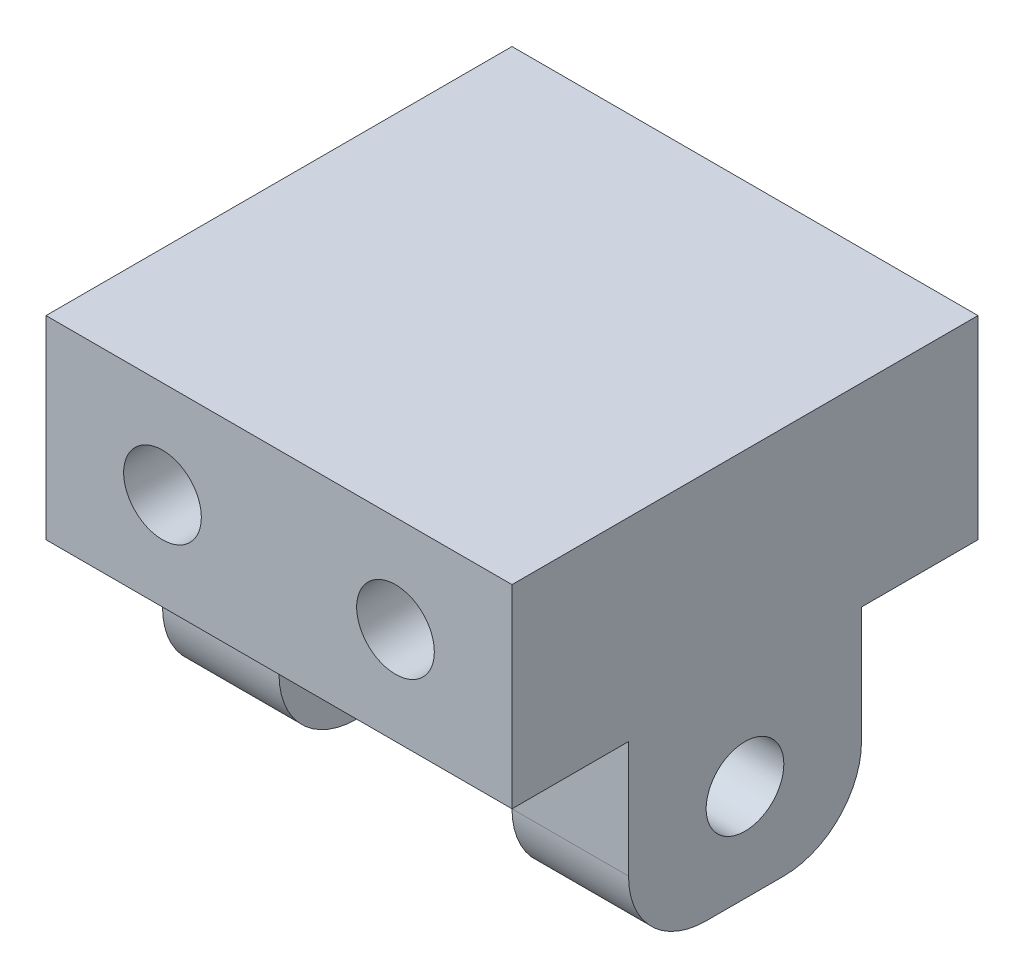
ISO-10303-21;
HEADER;
FILE_DESCRIPTION(('STEP AP214'),'2;1');
FILE_NAME('part.step','',(''),(''),'','','');
FILE_SCHEMA(('AUTOMOTIVE_DESIGN { 1 0 10303 214 1 1 1 1 }'));
ENDSEC;
DATA;
#1=APPLICATION_CONTEXT('core data for automotive mechanical design processes');
#2=APPLICATION_PROTOCOL_DEFINITION('international standard','automotive_design',2000,#1);
#3=PRODUCT_CONTEXT('',#1,'mechanical');
#4=PRODUCT('Part','Part','',(#3));
#5=PRODUCT_RELATED_PRODUCT_CATEGORY('part','',(#4));
#6=PRODUCT_DEFINITION_FORMATION('','',#4);
#7=PRODUCT_DEFINITION_CONTEXT('part definition',#1,'design');
#8=PRODUCT_DEFINITION('design','',#6,#7);
#9=PRODUCT_DEFINITION_SHAPE('','',#8);
#10=(LENGTH_UNIT() NAMED_UNIT(*) SI_UNIT(.MILLI.,.METRE.));
#11=(NAMED_UNIT(*) PLANE_ANGLE_UNIT() SI_UNIT($,.RADIAN.));
#12=(NAMED_UNIT(*) SI_UNIT($,.STERADIAN.) SOLID_ANGLE_UNIT());
#13=UNCERTAINTY_MEASURE_WITH_UNIT(LENGTH_MEASURE(1.E-05),#10,'distance_accuracy_value','');
#14=(GEOMETRIC_REPRESENTATION_CONTEXT(3) GLOBAL_UNCERTAINTY_ASSIGNED_CONTEXT((#13)) GLOBAL_UNIT_ASSIGNED_CONTEXT((#10,
#11,#12)) REPRESENTATION_CONTEXT('',''));
#15=CARTESIAN_POINT('',(0.,0.,0.));
#16=DIRECTION('',(0.,0.,1.));
#17=DIRECTION('',(1.,0.,0.));
#18=AXIS2_PLACEMENT_3D('',#15,#16,#17);
#19=CARTESIAN_POINT('',(-6.,-2.5,-6.));
#20=DIRECTION('',(0.,-1.,0.));
#21=DIRECTION('',(1.,0.,0.));
#22=AXIS2_PLACEMENT_3D('',#19,#20,#21);
#23=PLANE('',#22);
#24=DIRECTION('',(0.,0.,1.));
#25=VECTOR('',#24,1.);
#26=CARTESIAN_POINT('',(-6.,-2.5,-6.));
#27=LINE('',#26,#25);
#28=CARTESIAN_POINT('',(-6.,-2.5,3.));
#29=VERTEX_POINT('',#28);
#30=CARTESIAN_POINT('',(-6.,-2.5,6.));
#31=VERTEX_POINT('',#30);
#32=EDGE_CURVE('E180',#29,#31,#27,.T.);
#33=ORIENTED_EDGE('',*,*,#32,.F.);
#34=DIRECTION('',(-1.,0.,0.));
#35=VECTOR('',#34,1.);
#36=CARTESIAN_POINT('',(-3.,-2.5,3.));
#37=LINE('',#36,#35);
#38=CARTESIAN_POINT('',(-3.,-2.5,3.));
#39=VERTEX_POINT('',#38);
#40=EDGE_CURVE('E173',#39,#29,#37,.T.);
#41=ORIENTED_EDGE('',*,*,#40,.F.);
#42=DIRECTION('',(0.,0.,1.));
#43=VECTOR('',#42,1.);
#44=CARTESIAN_POINT('',(-3.,-2.5,3.));
#45=LINE('',#44,#43);
#46=CARTESIAN_POINT('',(-3.,-2.5,-3.));
#47=VERTEX_POINT('',#46);
#48=EDGE_CURVE('E160',#47,#39,#45,.T.);
#49=ORIENTED_EDGE('',*,*,#48,.F.);
#50=DIRECTION('',(-1.,0.,0.));
#51=VECTOR('',#50,1.);
#52=CARTESIAN_POINT('',(-3.,-2.5,-3.));
#53=LINE('',#52,#51);
#54=CARTESIAN_POINT('',(-6.,-2.5,-3.));
#55=VERTEX_POINT('',#54);
#56=EDGE_CURVE('E182',#47,#55,#53,.T.);
#57=ORIENTED_EDGE('',*,*,#56,.T.);
#58=CARTESIAN_POINT('',(-6.,-2.5,-6.));
#59=VERTEX_POINT('',#58);
#60=EDGE_CURVE('E293',#59,#55,#27,.T.);
#61=ORIENTED_EDGE('',*,*,#60,.F.);
#62=DIRECTION('',(1.,0.,0.));
#63=VECTOR('',#62,1.);
#64=CARTESIAN_POINT('',(-6.,-2.5,-6.));
#65=LINE('',#64,#63);
#66=CARTESIAN_POINT('',(6.,-2.5,-6.));
#67=VERTEX_POINT('',#66);
#68=EDGE_CURVE('E269',#59,#67,#65,.T.);
#69=ORIENTED_EDGE('',*,*,#68,.T.);
#70=DIRECTION('',(0.,0.,1.));
#71=VECTOR('',#70,1.);
#72=CARTESIAN_POINT('',(6.,-2.5,-6.));
#73=LINE('',#72,#71);
#74=CARTESIAN_POINT('',(6.,-2.5,-3.));
#75=VERTEX_POINT('',#74);
#76=EDGE_CURVE('E288',#67,#75,#73,.T.);
#77=ORIENTED_EDGE('',*,*,#76,.T.);
#78=DIRECTION('',(1.,0.,0.));
#79=VECTOR('',#78,1.);
#80=CARTESIAN_POINT('',(3.,-2.5,-3.));
#81=LINE('',#80,#79);
#82=CARTESIAN_POINT('',(3.,-2.5,-3.));
#83=VERTEX_POINT('',#82);
#84=EDGE_CURVE('E216',#83,#75,#81,.T.);
#85=ORIENTED_EDGE('',*,*,#84,.F.);
#86=DIRECTION('',(0.,0.,1.));
#87=VECTOR('',#86,1.);
#88=CARTESIAN_POINT('',(3.,-2.5,3.));
#89=LINE('',#88,#87);
#90=CARTESIAN_POINT('',(3.,-2.5,3.));
#91=VERTEX_POINT('',#90);
#92=EDGE_CURVE('E212',#83,#91,#89,.T.);
#93=ORIENTED_EDGE('',*,*,#92,.T.);
#94=DIRECTION('',(1.,0.,0.));
#95=VECTOR('',#94,1.);
#96=CARTESIAN_POINT('',(3.,-2.5,3.));
#97=LINE('',#96,#95);
#98=CARTESIAN_POINT('',(6.,-2.5,3.));
#99=VERTEX_POINT('',#98);
#100=EDGE_CURVE('E226',#91,#99,#97,.T.);
#101=ORIENTED_EDGE('',*,*,#100,.T.);
#102=CARTESIAN_POINT('',(6.,-2.5,6.));
#103=VERTEX_POINT('',#102);
#104=EDGE_CURVE('E292',#99,#103,#73,.T.);
#105=ORIENTED_EDGE('',*,*,#104,.T.);
#106=DIRECTION('',(1.,0.,0.));
#107=VECTOR('',#106,1.);
#108=CARTESIAN_POINT('',(-6.,-2.5,6.));
#109=LINE('',#108,#107);
#110=EDGE_CURVE('E253',#31,#103,#109,.T.);
#111=ORIENTED_EDGE('',*,*,#110,.F.);
#112=EDGE_LOOP('',(#33,#41,#49,#57,#61,#69,#77,#85,#93,#101,#105,#111));
#113=FACE_BOUND('',#112,.T.);
#114=ADVANCED_FACE('F45',(#113),#23,.T.);
#115=CARTESIAN_POINT('',(-6.,2.5,-6.));
#116=DIRECTION('',(-1.,0.,0.));
#117=DIRECTION('',(0.,0.,1.));
#118=AXIS2_PLACEMENT_3D('',#115,#116,#117);
#119=PLANE('',#118);
#120=DIRECTION('',(0.,0.,-1.));
#121=VECTOR('',#120,1.);
#122=CARTESIAN_POINT('',(-6.,-7.5,3.));
#123=LINE('',#122,#121);
#124=CARTESIAN_POINT('',(-6.,-7.5,0.999999999999999));
#125=VERTEX_POINT('',#124);
#126=CARTESIAN_POINT('',(-6.,-7.5,-1.));
#127=VERTEX_POINT('',#126);
#128=EDGE_CURVE('E176',#125,#127,#123,.T.);
#129=ORIENTED_EDGE('',*,*,#128,.F.);
#130=CARTESIAN_POINT('',(-6.,-5.5,0.999999999999999));
#131=DIRECTION('',(-1.,0.,0.));
#132=DIRECTION('',(0.,0.,1.));
#133=AXIS2_PLACEMENT_3D('',#130,#131,#132);
#134=CIRCLE('',#133,2.);
#135=CARTESIAN_POINT('',(-6.,-5.5,3.));
#136=VERTEX_POINT('',#135);
#137=EDGE_CURVE('E332',#125,#136,#134,.T.);
#138=ORIENTED_EDGE('',*,*,#137,.T.);
#139=DIRECTION('',(0.,-1.,0.));
#140=VECTOR('',#139,1.);
#141=CARTESIAN_POINT('',(-6.,-2.5,3.));
#142=LINE('',#141,#140);
#143=EDGE_CURVE('E351',#29,#136,#142,.T.);
#144=ORIENTED_EDGE('',*,*,#143,.F.);
#145=ORIENTED_EDGE('',*,*,#32,.T.);
#146=DIRECTION('',(0.,-1.,0.));
#147=VECTOR('',#146,1.);
#148=CARTESIAN_POINT('',(-6.,2.5,6.));
#149=LINE('',#148,#147);
#150=CARTESIAN_POINT('',(-6.,2.5,6.));
#151=VERTEX_POINT('',#150);
#152=EDGE_CURVE('E243',#151,#31,#149,.T.);
#153=ORIENTED_EDGE('',*,*,#152,.F.);
#154=DIRECTION('',(0.,0.,1.));
#155=VECTOR('',#154,1.);
#156=CARTESIAN_POINT('',(-6.,2.5,-6.));
#157=LINE('',#156,#155);
#158=CARTESIAN_POINT('',(-6.,2.5,-6.));
#159=VERTEX_POINT('',#158);
#160=EDGE_CURVE('E281',#159,#151,#157,.T.);
#161=ORIENTED_EDGE('',*,*,#160,.F.);
#162=DIRECTION('',(0.,-1.,0.));
#163=VECTOR('',#162,1.);
#164=CARTESIAN_POINT('',(-6.,2.5,-6.));
#165=LINE('',#164,#163);
#166=EDGE_CURVE('E265',#159,#59,#165,.T.);
#167=ORIENTED_EDGE('',*,*,#166,.T.);
#168=ORIENTED_EDGE('',*,*,#60,.T.);
#169=DIRECTION('',(0.,1.,0.));
#170=VECTOR('',#169,1.);
#171=CARTESIAN_POINT('',(-6.,-2.5,-3.));
#172=LINE('',#171,#170);
#173=CARTESIAN_POINT('',(-6.,-5.5,-3.));
#174=VERTEX_POINT('',#173);
#175=EDGE_CURVE('E353',#174,#55,#172,.T.);
#176=ORIENTED_EDGE('',*,*,#175,.F.);
#177=CARTESIAN_POINT('',(-6.,-5.5,-1.));
#178=DIRECTION('',(-1.,0.,0.));
#179=DIRECTION('',(0.,0.,1.));
#180=AXIS2_PLACEMENT_3D('',#177,#178,#179);
#181=CIRCLE('',#180,2.);
#182=EDGE_CURVE('E329',#174,#127,#181,.T.);
#183=ORIENTED_EDGE('',*,*,#182,.T.);
#184=EDGE_LOOP('',(#129,#138,#144,#145,#153,#161,#167,#168,#176,#183));
#185=FACE_BOUND('',#184,.T.);
#186=CARTESIAN_POINT('',(-6.,-5.,0.));
#187=DIRECTION('',(1.,0.,0.));
#188=DIRECTION('',(0.,0.,-1.));
#189=AXIS2_PLACEMENT_3D('',#186,#187,#188);
#190=CIRCLE('',#189,1.);
#191=CARTESIAN_POINT('',(-6.,-5.,-1.));
#192=VERTEX_POINT('',#191);
#193=EDGE_CURVE('E360',#192,#192,#190,.T.);
#194=ORIENTED_EDGE('',*,*,#193,.T.);
#195=EDGE_LOOP('',(#194));
#196=FACE_BOUND('',#195,.T.);
#197=ADVANCED_FACE('F349',(#185,#196),#119,.T.);
#198=CARTESIAN_POINT('',(-6.,2.5,-6.));
#199=DIRECTION('',(0.,1.,0.));
#200=DIRECTION('',(-1.,0.,0.));
#201=AXIS2_PLACEMENT_3D('',#198,#199,#200);
#202=PLANE('',#201);
#203=ORIENTED_EDGE('',*,*,#160,.T.);
#204=DIRECTION('',(-1.,0.,0.));
#205=VECTOR('',#204,1.);
#206=CARTESIAN_POINT('',(-6.,2.5,6.));
#207=LINE('',#206,#205);
#208=CARTESIAN_POINT('',(6.,2.5,6.));
#209=VERTEX_POINT('',#208);
#210=EDGE_CURVE('E261',#209,#151,#207,.T.);
#211=ORIENTED_EDGE('',*,*,#210,.F.);
#212=DIRECTION('',(0.,0.,1.));
#213=VECTOR('',#212,1.);
#214=CARTESIAN_POINT('',(6.,2.5,-6.));
#215=LINE('',#214,#213);
#216=CARTESIAN_POINT('',(6.,2.5,-6.));
#217=VERTEX_POINT('',#216);
#218=EDGE_CURVE('E285',#217,#209,#215,.T.);
#219=ORIENTED_EDGE('',*,*,#218,.F.);
#220=DIRECTION('',(-1.,0.,0.));
#221=VECTOR('',#220,1.);
#222=CARTESIAN_POINT('',(-6.,2.5,-6.));
#223=LINE('',#222,#221);
#224=EDGE_CURVE('E277',#217,#159,#223,.T.);
#225=ORIENTED_EDGE('',*,*,#224,.T.);
#226=EDGE_LOOP('',(#203,#211,#219,#225));
#227=FACE_BOUND('',#226,.T.);
#228=ADVANCED_FACE('F419',(#227),#202,.T.);
#229=CARTESIAN_POINT('',(6.,2.5,-6.));
#230=DIRECTION('',(1.,0.,0.));
#231=DIRECTION('',(0.,0.,-1.));
#232=AXIS2_PLACEMENT_3D('',#229,#230,#231);
#233=PLANE('',#232);
#234=DIRECTION('',(0.,-1.,0.));
#235=VECTOR('',#234,1.);
#236=CARTESIAN_POINT('',(6.,-2.5,3.));
#237=LINE('',#236,#235);
#238=CARTESIAN_POINT('',(6.,-5.5,3.));
#239=VERTEX_POINT('',#238);
#240=EDGE_CURVE('E196',#99,#239,#237,.T.);
#241=ORIENTED_EDGE('',*,*,#240,.T.);
#242=CARTESIAN_POINT('',(6.,-5.5,0.999999999999999));
#243=DIRECTION('',(1.,0.,0.));
#244=DIRECTION('',(0.,0.,-1.));
#245=AXIS2_PLACEMENT_3D('',#242,#243,#244);
#246=CIRCLE('',#245,2.);
#247=CARTESIAN_POINT('',(6.,-7.5,0.999999999999999));
#248=VERTEX_POINT('',#247);
#249=EDGE_CURVE('E303',#239,#248,#246,.T.);
#250=ORIENTED_EDGE('',*,*,#249,.T.);
#251=DIRECTION('',(0.,0.,-1.));
#252=VECTOR('',#251,1.);
#253=CARTESIAN_POINT('',(6.,-7.5,3.));
#254=LINE('',#253,#252);
#255=CARTESIAN_POINT('',(6.,-7.5,-1.));
#256=VERTEX_POINT('',#255);
#257=EDGE_CURVE('E220',#248,#256,#254,.T.);
#258=ORIENTED_EDGE('',*,*,#257,.T.);
#259=CARTESIAN_POINT('',(6.,-5.5,-1.));
#260=DIRECTION('',(1.,0.,0.));
#261=DIRECTION('',(0.,0.,-1.));
#262=AXIS2_PLACEMENT_3D('',#259,#260,#261);
#263=CIRCLE('',#262,2.);
#264=CARTESIAN_POINT('',(6.,-5.5,-3.));
#265=VERTEX_POINT('',#264);
#266=EDGE_CURVE('E300',#256,#265,#263,.T.);
#267=ORIENTED_EDGE('',*,*,#266,.T.);
#268=DIRECTION('',(0.,1.,0.));
#269=VECTOR('',#268,1.);
#270=CARTESIAN_POINT('',(6.,-2.5,-3.));
#271=LINE('',#270,#269);
#272=EDGE_CURVE('E205',#265,#75,#271,.T.);
#273=ORIENTED_EDGE('',*,*,#272,.T.);
#274=ORIENTED_EDGE('',*,*,#76,.F.);
#275=DIRECTION('',(0.,1.,0.));
#276=VECTOR('',#275,1.);
#277=CARTESIAN_POINT('',(6.,2.5,-6.));
#278=LINE('',#277,#276);
#279=EDGE_CURVE('E273',#67,#217,#278,.T.);
#280=ORIENTED_EDGE('',*,*,#279,.T.);
#281=ORIENTED_EDGE('',*,*,#218,.T.);
#282=DIRECTION('',(0.,1.,0.));
#283=VECTOR('',#282,1.);
#284=CARTESIAN_POINT('',(6.,2.5,6.));
#285=LINE('',#284,#283);
#286=EDGE_CURVE('E257',#103,#209,#285,.T.);
#287=ORIENTED_EDGE('',*,*,#286,.F.);
#288=ORIENTED_EDGE('',*,*,#104,.F.);
#289=EDGE_LOOP('',(#241,#250,#258,#267,#273,#274,#280,#281,#287,#288));
#290=FACE_BOUND('',#289,.T.);
#291=CARTESIAN_POINT('',(6.,-5.,0.));
#292=DIRECTION('',(1.,0.,0.));
#293=DIRECTION('',(0.,0.,-1.));
#294=AXIS2_PLACEMENT_3D('',#291,#292,#293);
#295=CIRCLE('',#294,1.);
#296=CARTESIAN_POINT('',(6.,-5.,-1.));
#297=VERTEX_POINT('',#296);
#298=EDGE_CURVE('E187',#297,#297,#295,.T.);
#299=ORIENTED_EDGE('',*,*,#298,.F.);
#300=EDGE_LOOP('',(#299));
#301=FACE_BOUND('',#300,.T.);
#302=ADVANCED_FACE('F376',(#290,#301),#233,.T.);
#303=CARTESIAN_POINT('',(0.,0.,-6.));
#304=DIRECTION('',(0.,0.,1.));
#305=DIRECTION('',(1.,0.,0.));
#306=AXIS2_PLACEMENT_3D('',#303,#304,#305);
#307=PLANE('',#306);
#308=CARTESIAN_POINT('',(-3.,0.,-6.));
#309=DIRECTION('',(0.,0.,1.));
#310=DIRECTION('',(1.,0.,0.));
#311=AXIS2_PLACEMENT_3D('',#308,#309,#310);
#312=CIRCLE('',#311,1.);
#313=CARTESIAN_POINT('',(-2.,0.,-6.));
#314=VERTEX_POINT('',#313);
#315=EDGE_CURVE('E238',#314,#314,#312,.F.);
#316=ORIENTED_EDGE('',*,*,#315,.F.);
#317=EDGE_LOOP('',(#316));
#318=FACE_BOUND('',#317,.T.);
#319=CARTESIAN_POINT('',(3.,0.,-6.));
#320=DIRECTION('',(0.,0.,1.));
#321=DIRECTION('',(1.,0.,0.));
#322=AXIS2_PLACEMENT_3D('',#319,#320,#321);
#323=CIRCLE('',#322,1.);
#324=CARTESIAN_POINT('',(4.,0.,-6.));
#325=VERTEX_POINT('',#324);
#326=EDGE_CURVE('E230',#325,#325,#323,.F.);
#327=ORIENTED_EDGE('',*,*,#326,.F.);
#328=EDGE_LOOP('',(#327));
#329=FACE_BOUND('',#328,.T.);
#330=ORIENTED_EDGE('',*,*,#166,.F.);
#331=ORIENTED_EDGE('',*,*,#224,.F.);
#332=ORIENTED_EDGE('',*,*,#279,.F.);
#333=ORIENTED_EDGE('',*,*,#68,.F.);
#334=EDGE_LOOP('',(#330,#331,#332,#333));
#335=FACE_BOUND('',#334,.T.);
#336=ADVANCED_FACE('F373',(#318,#329,#335),#307,.F.);
#337=CARTESIAN_POINT('',(0.,0.,6.));
#338=DIRECTION('',(0.,0.,1.));
#339=DIRECTION('',(1.,0.,0.));
#340=AXIS2_PLACEMENT_3D('',#337,#338,#339);
#341=PLANE('',#340);
#342=CARTESIAN_POINT('',(-3.,0.,6.));
#343=DIRECTION('',(0.,0.,1.));
#344=DIRECTION('',(1.,0.,0.));
#345=AXIS2_PLACEMENT_3D('',#342,#343,#344);
#346=CIRCLE('',#345,1.);
#347=CARTESIAN_POINT('',(-2.,0.,6.));
#348=VERTEX_POINT('',#347);
#349=EDGE_CURVE('E234',#348,#348,#346,.T.);
#350=ORIENTED_EDGE('',*,*,#349,.F.);
#351=EDGE_LOOP('',(#350));
#352=FACE_BOUND('',#351,.T.);
#353=CARTESIAN_POINT('',(3.,0.,6.));
#354=DIRECTION('',(0.,0.,1.));
#355=DIRECTION('',(1.,0.,0.));
#356=AXIS2_PLACEMENT_3D('',#353,#354,#355);
#357=CIRCLE('',#356,1.);
#358=CARTESIAN_POINT('',(4.,0.,6.));
#359=VERTEX_POINT('',#358);
#360=EDGE_CURVE('E239',#359,#359,#357,.T.);
#361=ORIENTED_EDGE('',*,*,#360,.F.);
#362=EDGE_LOOP('',(#361));
#363=FACE_BOUND('',#362,.T.);
#364=ORIENTED_EDGE('',*,*,#152,.T.);
#365=ORIENTED_EDGE('',*,*,#110,.T.);
#366=ORIENTED_EDGE('',*,*,#286,.T.);
#367=ORIENTED_EDGE('',*,*,#210,.T.);
#368=EDGE_LOOP('',(#364,#365,#366,#367));
#369=FACE_BOUND('',#368,.T.);
#370=ADVANCED_FACE('F429',(#352,#363,#369),#341,.T.);
#371=CARTESIAN_POINT('',(3.,0.,-8.82842712474619));
#372=DIRECTION('',(0.,0.,1.));
#373=DIRECTION('',(1.,0.,0.));
#374=AXIS2_PLACEMENT_3D('',#371,#372,#373);
#375=CYLINDRICAL_SURFACE('',#374,1.);
#376=ORIENTED_EDGE('',*,*,#326,.T.);
#377=EDGE_LOOP('',(#376));
#378=FACE_BOUND('',#377,.T.);
#379=ORIENTED_EDGE('',*,*,#360,.T.);
#380=EDGE_LOOP('',(#379));
#381=FACE_BOUND('',#380,.T.);
#382=ADVANCED_FACE('F433',(#378,#381),#375,.F.);
#383=CARTESIAN_POINT('',(-3.,0.,-8.82842712474619));
#384=DIRECTION('',(0.,0.,1.));
#385=DIRECTION('',(1.,0.,0.));
#386=AXIS2_PLACEMENT_3D('',#383,#384,#385);
#387=CYLINDRICAL_SURFACE('',#386,1.);
#388=ORIENTED_EDGE('',*,*,#315,.T.);
#389=EDGE_LOOP('',(#388));
#390=FACE_BOUND('',#389,.T.);
#391=ORIENTED_EDGE('',*,*,#349,.T.);
#392=EDGE_LOOP('',(#391));
#393=FACE_BOUND('',#392,.T.);
#394=ADVANCED_FACE('F437',(#390,#393),#387,.F.);
#395=CARTESIAN_POINT('',(3.,-2.5,3.));
#396=DIRECTION('',(0.,0.,1.));
#397=DIRECTION('',(1.,0.,0.));
#398=AXIS2_PLACEMENT_3D('',#395,#396,#397);
#399=PLANE('',#398);
#400=DIRECTION('',(0.,-1.,0.));
#401=VECTOR('',#400,1.);
#402=CARTESIAN_POINT('',(3.,-2.5,3.));
#403=LINE('',#402,#401);
#404=CARTESIAN_POINT('',(3.,-5.5,3.));
#405=VERTEX_POINT('',#404);
#406=EDGE_CURVE('E200',#91,#405,#403,.T.);
#407=ORIENTED_EDGE('',*,*,#406,.T.);
#408=DIRECTION('',(1.,0.,0.));
#409=VECTOR('',#408,1.);
#410=CARTESIAN_POINT('',(3.,-5.5,3.));
#411=LINE('',#410,#409);
#412=EDGE_CURVE('E284',#405,#239,#411,.T.);
#413=ORIENTED_EDGE('',*,*,#412,.T.);
#414=ORIENTED_EDGE('',*,*,#240,.F.);
#415=ORIENTED_EDGE('',*,*,#100,.F.);
#416=EDGE_LOOP('',(#407,#413,#414,#415));
#417=FACE_BOUND('',#416,.T.);
#418=ADVANCED_FACE('F394',(#417),#399,.T.);
#419=CARTESIAN_POINT('',(3.,-2.5,-3.));
#420=DIRECTION('',(0.,0.,-1.));
#421=DIRECTION('',(-1.,0.,0.));
#422=AXIS2_PLACEMENT_3D('',#419,#420,#421);
#423=PLANE('',#422);
#424=ORIENTED_EDGE('',*,*,#272,.F.);
#425=DIRECTION('',(1.,0.,0.));
#426=VECTOR('',#425,1.);
#427=CARTESIAN_POINT('',(3.,-5.5,-3.));
#428=LINE('',#427,#426);
#429=CARTESIAN_POINT('',(3.,-5.5,-3.));
#430=VERTEX_POINT('',#429);
#431=EDGE_CURVE('E319',#265,#430,#428,.F.);
#432=ORIENTED_EDGE('',*,*,#431,.T.);
#433=DIRECTION('',(0.,1.,0.));
#434=VECTOR('',#433,1.);
#435=CARTESIAN_POINT('',(3.,-2.5,-3.));
#436=LINE('',#435,#434);
#437=EDGE_CURVE('E209',#430,#83,#436,.T.);
#438=ORIENTED_EDGE('',*,*,#437,.T.);
#439=ORIENTED_EDGE('',*,*,#84,.T.);
#440=EDGE_LOOP('',(#424,#432,#438,#439));
#441=FACE_BOUND('',#440,.T.);
#442=ADVANCED_FACE('F383',(#441),#423,.T.);
#443=CARTESIAN_POINT('',(3.,-7.5,3.));
#444=DIRECTION('',(0.,-1.,0.));
#445=DIRECTION('',(0.,0.,-1.));
#446=AXIS2_PLACEMENT_3D('',#443,#444,#445);
#447=PLANE('',#446);
#448=ORIENTED_EDGE('',*,*,#257,.F.);
#449=DIRECTION('',(1.,0.,0.));
#450=VECTOR('',#449,1.);
#451=CARTESIAN_POINT('',(3.,-7.5,0.999999999999999));
#452=LINE('',#451,#450);
#453=CARTESIAN_POINT('',(3.,-7.5,0.999999999999999));
#454=VERTEX_POINT('',#453);
#455=EDGE_CURVE('E310',#248,#454,#452,.F.);
#456=ORIENTED_EDGE('',*,*,#455,.T.);
#457=DIRECTION('',(0.,0.,-1.));
#458=VECTOR('',#457,1.);
#459=CARTESIAN_POINT('',(3.,-7.5,3.));
#460=LINE('',#459,#458);
#461=CARTESIAN_POINT('',(3.,-7.5,-1.));
#462=VERTEX_POINT('',#461);
#463=EDGE_CURVE('E204',#454,#462,#460,.T.);
#464=ORIENTED_EDGE('',*,*,#463,.T.);
#465=DIRECTION('',(1.,0.,0.));
#466=VECTOR('',#465,1.);
#467=CARTESIAN_POINT('',(3.,-7.5,-1.));
#468=LINE('',#467,#466);
#469=EDGE_CURVE('E306',#462,#256,#468,.T.);
#470=ORIENTED_EDGE('',*,*,#469,.T.);
#471=EDGE_LOOP('',(#448,#456,#464,#470));
#472=FACE_BOUND('',#471,.T.);
#473=ADVANCED_FACE('F401',(#472),#447,.T.);
#474=CARTESIAN_POINT('',(3.,0.,0.));
#475=DIRECTION('',(1.,0.,0.));
#476=DIRECTION('',(0.,0.,-1.));
#477=AXIS2_PLACEMENT_3D('',#474,#475,#476);
#478=PLANE('',#477);
#479=CARTESIAN_POINT('',(3.,-5.,0.));
#480=DIRECTION('',(1.,0.,0.));
#481=DIRECTION('',(0.,0.,-1.));
#482=AXIS2_PLACEMENT_3D('',#479,#480,#481);
#483=CIRCLE('',#482,1.);
#484=CARTESIAN_POINT('',(3.,-5.,-1.));
#485=VERTEX_POINT('',#484);
#486=EDGE_CURVE('E192',#485,#485,#483,.T.);
#487=ORIENTED_EDGE('',*,*,#486,.T.);
#488=EDGE_LOOP('',(#487));
#489=FACE_BOUND('',#488,.T.);
#490=ORIENTED_EDGE('',*,*,#463,.F.);
#491=CARTESIAN_POINT('',(3.,-5.5,0.999999999999999));
#492=DIRECTION('',(1.,0.,0.));
#493=DIRECTION('',(0.,0.,-1.));
#494=AXIS2_PLACEMENT_3D('',#491,#492,#493);
#495=CIRCLE('',#494,2.);
#496=EDGE_CURVE('E316',#454,#405,#495,.F.);
#497=ORIENTED_EDGE('',*,*,#496,.T.);
#498=ORIENTED_EDGE('',*,*,#406,.F.);
#499=ORIENTED_EDGE('',*,*,#92,.F.);
#500=ORIENTED_EDGE('',*,*,#437,.F.);
#501=CARTESIAN_POINT('',(3.,-5.5,-1.));
#502=DIRECTION('',(1.,0.,0.));
#503=DIRECTION('',(0.,0.,-1.));
#504=AXIS2_PLACEMENT_3D('',#501,#502,#503);
#505=CIRCLE('',#504,2.);
#506=EDGE_CURVE('E313',#430,#462,#505,.F.);
#507=ORIENTED_EDGE('',*,*,#506,.T.);
#508=EDGE_LOOP('',(#490,#497,#498,#499,#500,#507));
#509=FACE_BOUND('',#508,.T.);
#510=ADVANCED_FACE('F390',(#489,#509),#478,.F.);
#511=CARTESIAN_POINT('',(3.,-5.,0.));
#512=DIRECTION('',(1.,0.,0.));
#513=DIRECTION('',(0.,0.,-1.));
#514=AXIS2_PLACEMENT_3D('',#511,#512,#513);
#515=CYLINDRICAL_SURFACE('',#514,1.);
#516=ORIENTED_EDGE('',*,*,#486,.F.);
#517=EDGE_LOOP('',(#516));
#518=FACE_BOUND('',#517,.T.);
#519=ORIENTED_EDGE('',*,*,#298,.T.);
#520=EDGE_LOOP('',(#519));
#521=FACE_BOUND('',#520,.T.);
#522=ADVANCED_FACE('F413',(#518,#521),#515,.F.);
#523=CARTESIAN_POINT('',(3.,-5.5,0.999999999999999));
#524=DIRECTION('',(1.,0.,0.));
#525=DIRECTION('',(0.,0.,-1.));
#526=AXIS2_PLACEMENT_3D('',#523,#524,#525);
#527=CYLINDRICAL_SURFACE('',#526,2.);
#528=ORIENTED_EDGE('',*,*,#496,.F.);
#529=ORIENTED_EDGE('',*,*,#455,.F.);
#530=ORIENTED_EDGE('',*,*,#249,.F.);
#531=ORIENTED_EDGE('',*,*,#412,.F.);
#532=EDGE_LOOP('',(#528,#529,#530,#531));
#533=FACE_BOUND('',#532,.T.);
#534=ADVANCED_FACE('F396',(#533),#527,.T.);
#535=CARTESIAN_POINT('',(3.,-5.5,-1.));
#536=DIRECTION('',(1.,0.,0.));
#537=DIRECTION('',(0.,0.,-1.));
#538=AXIS2_PLACEMENT_3D('',#535,#536,#537);
#539=CYLINDRICAL_SURFACE('',#538,2.);
#540=ORIENTED_EDGE('',*,*,#506,.F.);
#541=ORIENTED_EDGE('',*,*,#431,.F.);
#542=ORIENTED_EDGE('',*,*,#266,.F.);
#543=ORIENTED_EDGE('',*,*,#469,.F.);
#544=EDGE_LOOP('',(#540,#541,#542,#543));
#545=FACE_BOUND('',#544,.T.);
#546=ADVANCED_FACE('F404',(#545),#539,.T.);
#547=CARTESIAN_POINT('',(-3.,0.,0.));
#548=DIRECTION('',(-1.,0.,0.));
#549=DIRECTION('',(0.,0.,-1.));
#550=AXIS2_PLACEMENT_3D('',#547,#548,#549);
#551=PLANE('',#550);
#552=DIRECTION('',(0.,-1.,0.));
#553=VECTOR('',#552,1.);
#554=CARTESIAN_POINT('',(-3.,-2.5,3.));
#555=LINE('',#554,#553);
#556=CARTESIAN_POINT('',(-3.,-5.5,3.));
#557=VERTEX_POINT('',#556);
#558=EDGE_CURVE('E163',#39,#557,#555,.T.);
#559=ORIENTED_EDGE('',*,*,#558,.T.);
#560=CARTESIAN_POINT('',(-3.,-5.5,0.999999999999999));
#561=DIRECTION('',(-1.,0.,0.));
#562=DIRECTION('',(0.,0.,1.));
#563=AXIS2_PLACEMENT_3D('',#560,#561,#562);
#564=CIRCLE('',#563,2.);
#565=CARTESIAN_POINT('',(-3.,-7.5,0.999999999999999));
#566=VERTEX_POINT('',#565);
#567=EDGE_CURVE('E54',#557,#566,#564,.F.);
#568=ORIENTED_EDGE('',*,*,#567,.T.);
#569=DIRECTION('',(0.,0.,-1.));
#570=VECTOR('',#569,1.);
#571=CARTESIAN_POINT('',(-3.,-7.5,3.));
#572=LINE('',#571,#570);
#573=CARTESIAN_POINT('',(-3.,-7.5,-1.));
#574=VERTEX_POINT('',#573);
#575=EDGE_CURVE('E183',#566,#574,#572,.T.);
#576=ORIENTED_EDGE('',*,*,#575,.T.);
#577=CARTESIAN_POINT('',(-3.,-5.5,-1.));
#578=DIRECTION('',(-1.,0.,0.));
#579=DIRECTION('',(0.,0.,1.));
#580=AXIS2_PLACEMENT_3D('',#577,#578,#579);
#581=CIRCLE('',#580,2.);
#582=CARTESIAN_POINT('',(-3.,-5.5,-3.));
#583=VERTEX_POINT('',#582);
#584=EDGE_CURVE('E61',#574,#583,#581,.F.);
#585=ORIENTED_EDGE('',*,*,#584,.T.);
#586=DIRECTION('',(0.,1.,0.));
#587=VECTOR('',#586,1.);
#588=CARTESIAN_POINT('',(-3.,-2.5,-3.));
#589=LINE('',#588,#587);
#590=EDGE_CURVE('E165',#583,#47,#589,.T.);
#591=ORIENTED_EDGE('',*,*,#590,.T.);
#592=ORIENTED_EDGE('',*,*,#48,.T.);
#593=EDGE_LOOP('',(#559,#568,#576,#585,#591,#592));
#594=FACE_BOUND('',#593,.T.);
#595=CARTESIAN_POINT('',(-3.,-5.,0.));
#596=DIRECTION('',(1.,0.,0.));
#597=DIRECTION('',(0.,0.,-1.));
#598=AXIS2_PLACEMENT_3D('',#595,#596,#597);
#599=CIRCLE('',#598,1.);
#600=CARTESIAN_POINT('',(-3.,-5.,-1.));
#601=VERTEX_POINT('',#600);
#602=EDGE_CURVE('E354',#601,#601,#599,.T.);
#603=ORIENTED_EDGE('',*,*,#602,.F.);
#604=EDGE_LOOP('',(#603));
#605=FACE_BOUND('',#604,.T.);
#606=ADVANCED_FACE('F161',(#594,#605),#551,.F.);
#607=CARTESIAN_POINT('',(-3.,-2.5,3.));
#608=DIRECTION('',(0.,0.,-1.));
#609=DIRECTION('',(-1.,0.,0.));
#610=AXIS2_PLACEMENT_3D('',#607,#608,#609);
#611=PLANE('',#610);
#612=ORIENTED_EDGE('',*,*,#143,.T.);
#613=DIRECTION('',(-1.,0.,0.));
#614=VECTOR('',#613,1.);
#615=CARTESIAN_POINT('',(-3.,-5.5,3.));
#616=LINE('',#615,#614);
#617=EDGE_CURVE('E69',#136,#557,#616,.F.);
#618=ORIENTED_EDGE('',*,*,#617,.T.);
#619=ORIENTED_EDGE('',*,*,#558,.F.);
#620=ORIENTED_EDGE('',*,*,#40,.T.);
#621=EDGE_LOOP('',(#612,#618,#619,#620));
#622=FACE_BOUND('',#621,.T.);
#623=ADVANCED_FACE('F172',(#622),#611,.F.);
#624=CARTESIAN_POINT('',(-3.,-7.5,3.));
#625=DIRECTION('',(0.,1.,0.));
#626=DIRECTION('',(0.,0.,1.));
#627=AXIS2_PLACEMENT_3D('',#624,#625,#626);
#628=PLANE('',#627);
#629=ORIENTED_EDGE('',*,*,#575,.F.);
#630=DIRECTION('',(-1.,0.,0.));
#631=VECTOR('',#630,1.);
#632=CARTESIAN_POINT('',(-3.,-7.5,0.999999999999999));
#633=LINE('',#632,#631);
#634=EDGE_CURVE('E325',#566,#125,#633,.T.);
#635=ORIENTED_EDGE('',*,*,#634,.T.);
#636=ORIENTED_EDGE('',*,*,#128,.T.);
#637=DIRECTION('',(-1.,0.,0.));
#638=VECTOR('',#637,1.);
#639=CARTESIAN_POINT('',(-3.,-7.5,-1.));
#640=LINE('',#639,#638);
#641=EDGE_CURVE('E322',#127,#574,#640,.F.);
#642=ORIENTED_EDGE('',*,*,#641,.T.);
#643=EDGE_LOOP('',(#629,#635,#636,#642));
#644=FACE_BOUND('',#643,.T.);
#645=ADVANCED_FACE('F343',(#644),#628,.F.);
#646=CARTESIAN_POINT('',(-3.,-2.5,-3.));
#647=DIRECTION('',(0.,0.,1.));
#648=DIRECTION('',(1.,0.,0.));
#649=AXIS2_PLACEMENT_3D('',#646,#647,#648);
#650=PLANE('',#649);
#651=ORIENTED_EDGE('',*,*,#590,.F.);
#652=DIRECTION('',(-1.,0.,0.));
#653=VECTOR('',#652,1.);
#654=CARTESIAN_POINT('',(-3.,-5.5,-3.));
#655=LINE('',#654,#653);
#656=EDGE_CURVE('E11',#583,#174,#655,.T.);
#657=ORIENTED_EDGE('',*,*,#656,.T.);
#658=ORIENTED_EDGE('',*,*,#175,.T.);
#659=ORIENTED_EDGE('',*,*,#56,.F.);
#660=EDGE_LOOP('',(#651,#657,#658,#659));
#661=FACE_BOUND('',#660,.T.);
#662=ADVANCED_FACE('F368',(#661),#650,.F.);
#663=CARTESIAN_POINT('',(-3.,-5.,0.));
#664=DIRECTION('',(-1.,0.,0.));
#665=DIRECTION('',(0.,0.,1.));
#666=AXIS2_PLACEMENT_3D('',#663,#664,#665);
#667=CYLINDRICAL_SURFACE('',#666,1.);
#668=ORIENTED_EDGE('',*,*,#602,.T.);
#669=EDGE_LOOP('',(#668));
#670=FACE_BOUND('',#669,.T.);
#671=ORIENTED_EDGE('',*,*,#193,.F.);
#672=EDGE_LOOP('',(#671));
#673=FACE_BOUND('',#672,.T.);
#674=ADVANCED_FACE('F458',(#670,#673),#667,.F.);
#675=CARTESIAN_POINT('',(-3.,-5.5,0.999999999999999));
#676=DIRECTION('',(-1.,0.,0.));
#677=DIRECTION('',(0.,0.,1.));
#678=AXIS2_PLACEMENT_3D('',#675,#676,#677);
#679=CYLINDRICAL_SURFACE('',#678,2.);
#680=ORIENTED_EDGE('',*,*,#567,.F.);
#681=ORIENTED_EDGE('',*,*,#617,.F.);
#682=ORIENTED_EDGE('',*,*,#137,.F.);
#683=ORIENTED_EDGE('',*,*,#634,.F.);
#684=EDGE_LOOP('',(#680,#681,#682,#683));
#685=FACE_BOUND('',#684,.T.);
#686=ADVANCED_FACE('F347',(#685),#679,.T.);
#687=CARTESIAN_POINT('',(-3.,-5.5,-1.));
#688=DIRECTION('',(-1.,0.,0.));
#689=DIRECTION('',(0.,0.,1.));
#690=AXIS2_PLACEMENT_3D('',#687,#688,#689);
#691=CYLINDRICAL_SURFACE('',#690,2.);
#692=ORIENTED_EDGE('',*,*,#584,.F.);
#693=ORIENTED_EDGE('',*,*,#641,.F.);
#694=ORIENTED_EDGE('',*,*,#182,.F.);
#695=ORIENTED_EDGE('',*,*,#656,.F.);
#696=EDGE_LOOP('',(#692,#693,#694,#695));
#697=FACE_BOUND('',#696,.T.);
#698=ADVANCED_FACE('F47',(#697),#691,.T.);
#699=CLOSED_SHELL('',(#114,#197,#228,#302,#336,#370,#382,#394,#418,#442,#473,#510,#522,#534,
#546,#606,#623,#645,#662,#674,#686,#698));
#700=MANIFOLD_SOLID_BREP('B2',#699);
#701=ADVANCED_BREP_SHAPE_REPRESENTATION('',(#18,#700),#14);
#702=SHAPE_DEFINITION_REPRESENTATION(#9,#701);
ENDSEC;
END-ISO-10303-21;
